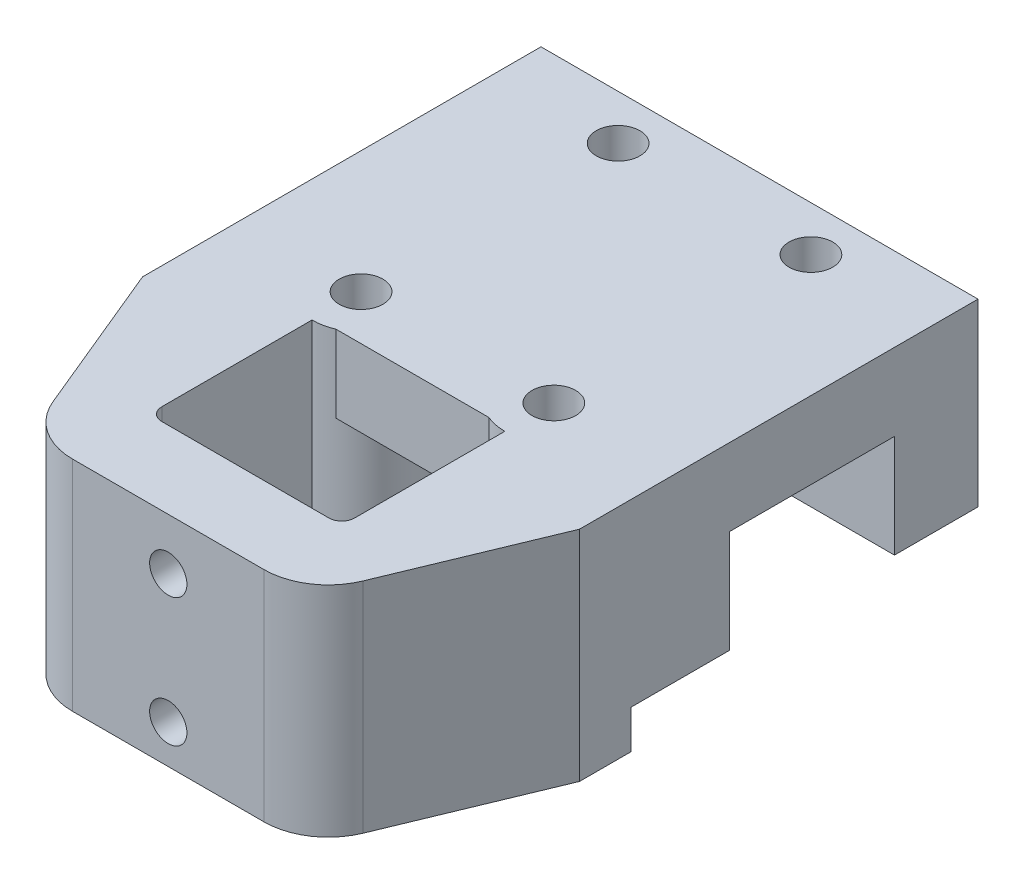
ISO-10303-21;
HEADER;
FILE_DESCRIPTION(('STEP AP214'),'2;1');
FILE_NAME('part.step','',(''),(''),'','','');
FILE_SCHEMA(('AUTOMOTIVE_DESIGN { 1 0 10303 214 1 1 1 1 }'));
ENDSEC;
DATA;
#1=APPLICATION_CONTEXT('core data for automotive mechanical design processes');
#2=APPLICATION_PROTOCOL_DEFINITION('international standard','automotive_design',2000,#1);
#3=PRODUCT_CONTEXT('',#1,'mechanical');
#4=PRODUCT('Part','Part','',(#3));
#5=PRODUCT_RELATED_PRODUCT_CATEGORY('part','',(#4));
#6=PRODUCT_DEFINITION_FORMATION('','',#4);
#7=PRODUCT_DEFINITION_CONTEXT('part definition',#1,'design');
#8=PRODUCT_DEFINITION('design','',#6,#7);
#9=PRODUCT_DEFINITION_SHAPE('','',#8);
#10=(LENGTH_UNIT() NAMED_UNIT(*) SI_UNIT(.MILLI.,.METRE.));
#11=(NAMED_UNIT(*) PLANE_ANGLE_UNIT() SI_UNIT($,.RADIAN.));
#12=(NAMED_UNIT(*) SI_UNIT($,.STERADIAN.) SOLID_ANGLE_UNIT());
#13=UNCERTAINTY_MEASURE_WITH_UNIT(LENGTH_MEASURE(1.E-05),#10,'distance_accuracy_value','');
#14=(GEOMETRIC_REPRESENTATION_CONTEXT(3) GLOBAL_UNCERTAINTY_ASSIGNED_CONTEXT((#13)) GLOBAL_UNIT_ASSIGNED_CONTEXT((#10,
#11,#12)) REPRESENTATION_CONTEXT('',''));
#15=CARTESIAN_POINT('',(0.,0.,0.));
#16=DIRECTION('',(0.,0.,1.));
#17=DIRECTION('',(1.,0.,0.));
#18=AXIS2_PLACEMENT_3D('',#15,#16,#17);
#19=CARTESIAN_POINT('',(17.,-14.,32.5));
#20=DIRECTION('',(0.,-1.,0.));
#21=DIRECTION('',(0.,0.,-1.));
#22=AXIS2_PLACEMENT_3D('',#19,#20,#21);
#23=PLANE('',#22);
#24=CARTESIAN_POINT('',(-7.49999999999998,-14.,10.));
#25=DIRECTION('',(0.,1.,0.));
#26=DIRECTION('',(0.,0.,1.));
#27=AXIS2_PLACEMENT_3D('',#24,#25,#26);
#28=CIRCLE('',#27,1.7);
#29=CARTESIAN_POINT('',(-7.49999999999998,-14.,11.7));
#30=VERTEX_POINT('',#29);
#31=EDGE_CURVE('E349',#30,#30,#28,.T.);
#32=ORIENTED_EDGE('',*,*,#31,.T.);
#33=EDGE_LOOP('',(#32));
#34=FACE_BOUND('',#33,.T.);
#35=DIRECTION('',(0.,0.,1.));
#36=VECTOR('',#35,1.);
#37=CARTESIAN_POINT('',(-7.49999999999997,-14.,13.5));
#38=LINE('',#37,#36);
#39=CARTESIAN_POINT('',(-7.49999999999997,-14.,13.5));
#40=VERTEX_POINT('',#39);
#41=CARTESIAN_POINT('',(-7.49999999999997,-14.,13.8165999999998));
#42=VERTEX_POINT('',#41);
#43=EDGE_CURVE('E251',#40,#42,#38,.T.);
#44=ORIENTED_EDGE('',*,*,#43,.F.);
#45=DIRECTION('',(1.,0.,0.));
#46=VECTOR('',#45,1.);
#47=CARTESIAN_POINT('',(-17.,-14.,13.5));
#48=LINE('',#47,#46);
#49=CARTESIAN_POINT('',(-17.,-14.,13.5));
#50=VERTEX_POINT('',#49);
#51=EDGE_CURVE('E248',#50,#40,#48,.T.);
#52=ORIENTED_EDGE('',*,*,#51,.F.);
#53=DIRECTION('',(0.,0.,1.));
#54=VECTOR('',#53,1.);
#55=CARTESIAN_POINT('',(-17.,-14.,-13.5));
#56=LINE('',#55,#54);
#57=CARTESIAN_POINT('',(-17.,-14.,5.81659999999999));
#58=VERTEX_POINT('',#57);
#59=EDGE_CURVE('E377',#58,#50,#56,.T.);
#60=ORIENTED_EDGE('',*,*,#59,.F.);
#61=DIRECTION('',(1.,0.,0.));
#62=VECTOR('',#61,1.);
#63=CARTESIAN_POINT('',(-17.,-14.,5.81659999999999));
#64=LINE('',#63,#62);
#65=CARTESIAN_POINT('',(-7.49999999999999,-14.,5.81659999999999));
#66=VERTEX_POINT('',#65);
#67=EDGE_CURVE('E344',#58,#66,#64,.T.);
#68=ORIENTED_EDGE('',*,*,#67,.T.);
#69=CARTESIAN_POINT('',(-7.49999999999998,-14.,9.81659999999987));
#70=DIRECTION('',(0.,-1.,0.));
#71=DIRECTION('',(0.,0.,1.));
#72=AXIS2_PLACEMENT_3D('',#69,#70,#71);
#73=CIRCLE('',#72,3.99999999999994);
#74=EDGE_CURVE('E298',#66,#42,#73,.T.);
#75=ORIENTED_EDGE('',*,*,#74,.T.);
#76=EDGE_LOOP('',(#44,#52,#60,#68,#75));
#77=FACE_BOUND('',#76,.T.);
#78=ADVANCED_FACE('F32',(#34,#77),#23,.T.);
#79=CARTESIAN_POINT('',(7.49999999999998,-14.,10.));
#80=DIRECTION('',(0.,1.,0.));
#81=DIRECTION('',(0.,0.,1.));
#82=AXIS2_PLACEMENT_3D('',#79,#80,#81);
#83=CIRCLE('',#82,1.7);
#84=CARTESIAN_POINT('',(7.49999999999998,-14.,11.7));
#85=VERTEX_POINT('',#84);
#86=EDGE_CURVE('E367',#85,#85,#83,.T.);
#87=ORIENTED_EDGE('',*,*,#86,.T.);
#88=EDGE_LOOP('',(#87));
#89=FACE_BOUND('',#88,.T.);
#90=DIRECTION('',(1.,0.,0.));
#91=VECTOR('',#90,1.);
#92=CARTESIAN_POINT('',(7.49999999999997,-14.,13.5));
#93=LINE('',#92,#91);
#94=CARTESIAN_POINT('',(7.49999999999997,-14.,13.5));
#95=VERTEX_POINT('',#94);
#96=CARTESIAN_POINT('',(17.,-14.,13.5));
#97=VERTEX_POINT('',#96);
#98=EDGE_CURVE('E258',#95,#97,#93,.T.);
#99=ORIENTED_EDGE('',*,*,#98,.F.);
#100=DIRECTION('',(0.,0.,-1.));
#101=VECTOR('',#100,1.);
#102=CARTESIAN_POINT('',(7.49999999999997,-14.,26.5));
#103=LINE('',#102,#101);
#104=CARTESIAN_POINT('',(7.49999999999997,-14.,13.8165999999999));
#105=VERTEX_POINT('',#104);
#106=EDGE_CURVE('E255',#105,#95,#103,.T.);
#107=ORIENTED_EDGE('',*,*,#106,.F.);
#108=CARTESIAN_POINT('',(7.49999999999998,-14.,9.81659999999987));
#109=DIRECTION('',(0.,-1.,0.));
#110=DIRECTION('',(0.,0.,1.));
#111=AXIS2_PLACEMENT_3D('',#108,#109,#110);
#112=CIRCLE('',#111,3.99999999999994);
#113=CARTESIAN_POINT('',(7.49999999999998,-14.,5.81659999999993));
#114=VERTEX_POINT('',#113);
#115=EDGE_CURVE('E295',#105,#114,#112,.T.);
#116=ORIENTED_EDGE('',*,*,#115,.T.);
#117=CARTESIAN_POINT('',(17.,-14.,5.81659999999999));
#118=VERTEX_POINT('',#117);
#119=EDGE_CURVE('E334',#114,#118,#64,.T.);
#120=ORIENTED_EDGE('',*,*,#119,.T.);
#121=DIRECTION('',(0.,0.,-1.));
#122=VECTOR('',#121,1.);
#123=CARTESIAN_POINT('',(17.,-14.,-13.5));
#124=LINE('',#123,#122);
#125=EDGE_CURVE('E371',#97,#118,#124,.T.);
#126=ORIENTED_EDGE('',*,*,#125,.F.);
#127=EDGE_LOOP('',(#99,#107,#116,#120,#126));
#128=FACE_BOUND('',#127,.T.);
#129=ADVANCED_FACE('F455',(#89,#128),#23,.T.);
#130=CARTESIAN_POINT('',(-17.,-14.,5.81659999999999));
#131=DIRECTION('',(0.,0.,1.));
#132=DIRECTION('',(1.,0.,0.));
#133=AXIS2_PLACEMENT_3D('',#130,#131,#132);
#134=PLANE('',#133);
#135=DIRECTION('',(0.,1.,0.));
#136=VECTOR('',#135,1.);
#137=CARTESIAN_POINT('',(7.49999999999998,-14.,5.81659999999993));
#138=LINE('',#137,#136);
#139=CARTESIAN_POINT('',(7.49999999999998,-6.,5.81659999999993));
#140=VERTEX_POINT('',#139);
#141=EDGE_CURVE('E312',#114,#140,#138,.T.);
#142=ORIENTED_EDGE('',*,*,#141,.T.);
#143=DIRECTION('',(1.,0.,0.));
#144=VECTOR('',#143,1.);
#145=CARTESIAN_POINT('',(-17.,-6.,5.81659999999999));
#146=LINE('',#145,#144);
#147=CARTESIAN_POINT('',(17.,-6.,5.81659999999999));
#148=VERTEX_POINT('',#147);
#149=EDGE_CURVE('E339',#140,#148,#146,.T.);
#150=ORIENTED_EDGE('',*,*,#149,.T.);
#151=DIRECTION('',(0.,-1.,0.));
#152=VECTOR('',#151,1.);
#153=CARTESIAN_POINT('',(17.,-14.,5.81659999999999));
#154=LINE('',#153,#152);
#155=EDGE_CURVE('E308',#148,#118,#154,.T.);
#156=ORIENTED_EDGE('',*,*,#155,.T.);
#157=ORIENTED_EDGE('',*,*,#119,.F.);
#158=EDGE_LOOP('',(#142,#150,#156,#157));
#159=FACE_BOUND('',#158,.T.);
#160=ADVANCED_FACE('F458',(#159),#134,.F.);
#161=CARTESIAN_POINT('',(17.,-14.,-13.5));
#162=DIRECTION('',(1.,0.,0.));
#163=DIRECTION('',(0.,0.,-1.));
#164=AXIS2_PLACEMENT_3D('',#161,#162,#163);
#165=PLANE('',#164);
#166=DIRECTION('',(0.,0.,-1.));
#167=VECTOR('',#166,1.);
#168=CARTESIAN_POINT('',(17.,0.,-13.5));
#169=LINE('',#168,#167);
#170=CARTESIAN_POINT('',(17.,0.,17.4999999999999));
#171=VERTEX_POINT('',#170);
#172=CARTESIAN_POINT('',(17.,0.,-13.5));
#173=VERTEX_POINT('',#172);
#174=EDGE_CURVE('E370',#171,#173,#169,.T.);
#175=ORIENTED_EDGE('',*,*,#174,.F.);
#176=DIRECTION('',(0.,-1.,0.));
#177=VECTOR('',#176,1.);
#178=CARTESIAN_POINT('',(17.,-14.,17.4999999999999));
#179=LINE('',#178,#177);
#180=CARTESIAN_POINT('',(17.,-17.,17.4999999999999));
#181=VERTEX_POINT('',#180);
#182=EDGE_CURVE('E396',#171,#181,#179,.T.);
#183=ORIENTED_EDGE('',*,*,#182,.T.);
#184=DIRECTION('',(0.,0.,1.));
#185=VECTOR('',#184,1.);
#186=CARTESIAN_POINT('',(17.,-17.,13.5000000000001));
#187=LINE('',#186,#185);
#188=CARTESIAN_POINT('',(17.,-17.,13.5000000000001));
#189=VERTEX_POINT('',#188);
#190=EDGE_CURVE('E244',#189,#181,#187,.T.);
#191=ORIENTED_EDGE('',*,*,#190,.F.);
#192=DIRECTION('',(0.,1.,0.));
#193=VECTOR('',#192,1.);
#194=CARTESIAN_POINT('',(17.,-17.,13.5000000000001));
#195=LINE('',#194,#193);
#196=EDGE_CURVE('E247',#189,#97,#195,.T.);
#197=ORIENTED_EDGE('',*,*,#196,.T.);
#198=ORIENTED_EDGE('',*,*,#125,.T.);
#199=ORIENTED_EDGE('',*,*,#155,.F.);
#200=DIRECTION('',(0.,0.,1.));
#201=VECTOR('',#200,1.);
#202=CARTESIAN_POINT('',(17.,-6.,5.81659999999999));
#203=LINE('',#202,#201);
#204=CARTESIAN_POINT('',(17.,-6.,-7.));
#205=VERTEX_POINT('',#204);
#206=EDGE_CURVE('E322',#205,#148,#203,.T.);
#207=ORIENTED_EDGE('',*,*,#206,.F.);
#208=DIRECTION('',(0.,1.,0.));
#209=VECTOR('',#208,1.);
#210=CARTESIAN_POINT('',(17.,-14.,-7.));
#211=LINE('',#210,#209);
#212=CARTESIAN_POINT('',(17.,-14.,-7.));
#213=VERTEX_POINT('',#212);
#214=EDGE_CURVE('E319',#213,#205,#211,.T.);
#215=ORIENTED_EDGE('',*,*,#214,.F.);
#216=CARTESIAN_POINT('',(17.,-14.,-13.5));
#217=VERTEX_POINT('',#216);
#218=EDGE_CURVE('E374',#213,#217,#124,.T.);
#219=ORIENTED_EDGE('',*,*,#218,.T.);
#220=DIRECTION('',(0.,1.,0.));
#221=VECTOR('',#220,1.);
#222=CARTESIAN_POINT('',(17.,-14.,-13.5));
#223=LINE('',#222,#221);
#224=EDGE_CURVE('E381',#217,#173,#223,.T.);
#225=ORIENTED_EDGE('',*,*,#224,.T.);
#226=EDGE_LOOP('',(#175,#183,#191,#197,#198,#199,#207,#215,#219,#225));
#227=FACE_BOUND('',#226,.T.);
#228=ADVANCED_FACE('F443',(#227),#165,.T.);
#229=CARTESIAN_POINT('',(17.,-14.,32.5));
#230=DIRECTION('',(0.,0.,1.));
#231=DIRECTION('',(1.,0.,0.));
#232=AXIS2_PLACEMENT_3D('',#229,#230,#231);
#233=PLANE('',#232);
#234=CARTESIAN_POINT('',(0.,-4.,32.5));
#235=DIRECTION('',(0.,0.,1.));
#236=DIRECTION('',(1.,0.,0.));
#237=AXIS2_PLACEMENT_3D('',#234,#235,#236);
#238=CIRCLE('',#237,1.44999999999999);
#239=CARTESIAN_POINT('',(1.44999999999999,-4.,32.5));
#240=VERTEX_POINT('',#239);
#241=EDGE_CURVE('E846',#240,#240,#238,.T.);
#242=ORIENTED_EDGE('',*,*,#241,.F.);
#243=EDGE_LOOP('',(#242));
#244=FACE_BOUND('',#243,.T.);
#245=CARTESIAN_POINT('',(0.,-14.,32.5));
#246=DIRECTION('',(0.,0.,1.));
#247=DIRECTION('',(1.,0.,0.));
#248=AXIS2_PLACEMENT_3D('',#245,#246,#247);
#249=CIRCLE('',#248,1.44999999999999);
#250=CARTESIAN_POINT('',(1.44999999999999,-14.,32.5));
#251=VERTEX_POINT('',#250);
#252=EDGE_CURVE('E839',#251,#251,#249,.T.);
#253=ORIENTED_EDGE('',*,*,#252,.F.);
#254=EDGE_LOOP('',(#253));
#255=FACE_BOUND('',#254,.T.);
#256=DIRECTION('',(-1.,0.,0.));
#257=VECTOR('',#256,1.);
#258=CARTESIAN_POINT('',(10.7867965644036,-17.,32.5));
#259=LINE('',#258,#257);
#260=CARTESIAN_POINT('',(7.44590337480707,-17.,32.5));
#261=VERTEX_POINT('',#260);
#262=CARTESIAN_POINT('',(-7.44590337480706,-17.,32.5));
#263=VERTEX_POINT('',#262);
#264=EDGE_CURVE('E211',#261,#263,#259,.T.);
#265=ORIENTED_EDGE('',*,*,#264,.F.);
#266=DIRECTION('',(0.,-1.,0.));
#267=VECTOR('',#266,1.);
#268=CARTESIAN_POINT('',(7.44590337480707,-14.,32.5));
#269=LINE('',#268,#267);
#270=CARTESIAN_POINT('',(7.44590337480707,0.,32.5));
#271=VERTEX_POINT('',#270);
#272=EDGE_CURVE('E419',#261,#271,#269,.F.);
#273=ORIENTED_EDGE('',*,*,#272,.T.);
#274=DIRECTION('',(1.,0.,0.));
#275=VECTOR('',#274,1.);
#276=CARTESIAN_POINT('',(17.,0.,32.5));
#277=LINE('',#276,#275);
#278=CARTESIAN_POINT('',(-7.44590337480706,0.,32.5));
#279=VERTEX_POINT('',#278);
#280=EDGE_CURVE('E388',#279,#271,#277,.T.);
#281=ORIENTED_EDGE('',*,*,#280,.F.);
#282=DIRECTION('',(0.,1.,0.));
#283=VECTOR('',#282,1.);
#284=CARTESIAN_POINT('',(-7.44590337480706,-14.,32.5));
#285=LINE('',#284,#283);
#286=EDGE_CURVE('E416',#279,#263,#285,.F.);
#287=ORIENTED_EDGE('',*,*,#286,.T.);
#288=EDGE_LOOP('',(#265,#273,#281,#287));
#289=FACE_BOUND('',#288,.T.);
#290=ADVANCED_FACE('F432',(#244,#255,#289),#233,.T.);
#291=CARTESIAN_POINT('',(-17.,-14.,-13.5));
#292=DIRECTION('',(-1.,0.,0.));
#293=DIRECTION('',(0.,0.,1.));
#294=AXIS2_PLACEMENT_3D('',#291,#292,#293);
#295=PLANE('',#294);
#296=ORIENTED_EDGE('',*,*,#59,.T.);
#297=DIRECTION('',(0.,1.,0.));
#298=VECTOR('',#297,1.);
#299=CARTESIAN_POINT('',(-17.,-17.,13.5));
#300=LINE('',#299,#298);
#301=CARTESIAN_POINT('',(-17.,-17.,13.5));
#302=VERTEX_POINT('',#301);
#303=EDGE_CURVE('E227',#302,#50,#300,.T.);
#304=ORIENTED_EDGE('',*,*,#303,.F.);
#305=DIRECTION('',(0.,0.,-1.));
#306=VECTOR('',#305,1.);
#307=CARTESIAN_POINT('',(-17.,-17.,17.4999999999998));
#308=LINE('',#307,#306);
#309=CARTESIAN_POINT('',(-17.,-17.,17.4999999999998));
#310=VERTEX_POINT('',#309);
#311=EDGE_CURVE('E207',#310,#302,#308,.T.);
#312=ORIENTED_EDGE('',*,*,#311,.F.);
#313=DIRECTION('',(0.,1.,0.));
#314=VECTOR('',#313,1.);
#315=CARTESIAN_POINT('',(-17.,-14.,17.4999999999999));
#316=LINE('',#315,#314);
#317=CARTESIAN_POINT('',(-17.,0.,17.4999999999998));
#318=VERTEX_POINT('',#317);
#319=EDGE_CURVE('E214',#310,#318,#316,.T.);
#320=ORIENTED_EDGE('',*,*,#319,.T.);
#321=DIRECTION('',(0.,0.,1.));
#322=VECTOR('',#321,1.);
#323=CARTESIAN_POINT('',(-17.,0.,-13.5));
#324=LINE('',#323,#322);
#325=CARTESIAN_POINT('',(-17.,0.,-13.5));
#326=VERTEX_POINT('',#325);
#327=EDGE_CURVE('E386',#326,#318,#324,.T.);
#328=ORIENTED_EDGE('',*,*,#327,.F.);
#329=DIRECTION('',(0.,1.,0.));
#330=VECTOR('',#329,1.);
#331=CARTESIAN_POINT('',(-17.,-14.,-13.5));
#332=LINE('',#331,#330);
#333=CARTESIAN_POINT('',(-17.,-14.,-13.5));
#334=VERTEX_POINT('',#333);
#335=EDGE_CURVE('E222',#334,#326,#332,.T.);
#336=ORIENTED_EDGE('',*,*,#335,.F.);
#337=CARTESIAN_POINT('',(-17.,-14.,-7.));
#338=VERTEX_POINT('',#337);
#339=EDGE_CURVE('E378',#334,#338,#56,.T.);
#340=ORIENTED_EDGE('',*,*,#339,.T.);
#341=DIRECTION('',(0.,1.,0.));
#342=VECTOR('',#341,1.);
#343=CARTESIAN_POINT('',(-17.,-14.,-7.));
#344=LINE('',#343,#342);
#345=CARTESIAN_POINT('',(-17.,-6.,-7.));
#346=VERTEX_POINT('',#345);
#347=EDGE_CURVE('E328',#338,#346,#344,.T.);
#348=ORIENTED_EDGE('',*,*,#347,.T.);
#349=DIRECTION('',(0.,0.,1.));
#350=VECTOR('',#349,1.);
#351=CARTESIAN_POINT('',(-17.,-6.,5.81659999999999));
#352=LINE('',#351,#350);
#353=CARTESIAN_POINT('',(-17.,-6.,5.81659999999999));
#354=VERTEX_POINT('',#353);
#355=EDGE_CURVE('E331',#346,#354,#352,.T.);
#356=ORIENTED_EDGE('',*,*,#355,.T.);
#357=DIRECTION('',(0.,-1.,0.));
#358=VECTOR('',#357,1.);
#359=CARTESIAN_POINT('',(-17.,-14.,5.81659999999999));
#360=LINE('',#359,#358);
#361=EDGE_CURVE('E325',#354,#58,#360,.T.);
#362=ORIENTED_EDGE('',*,*,#361,.T.);
#363=EDGE_LOOP('',(#296,#304,#312,#320,#328,#336,#340,#348,#356,#362));
#364=FACE_BOUND('',#363,.T.);
#365=ADVANCED_FACE('F225',(#364),#295,.T.);
#366=CARTESIAN_POINT('',(17.,-14.,-13.5));
#367=DIRECTION('',(0.,0.,-1.));
#368=DIRECTION('',(-1.,0.,0.));
#369=AXIS2_PLACEMENT_3D('',#366,#367,#368);
#370=PLANE('',#369);
#371=DIRECTION('',(-1.,0.,0.));
#372=VECTOR('',#371,1.);
#373=CARTESIAN_POINT('',(17.,0.,-13.5));
#374=LINE('',#373,#372);
#375=EDGE_CURVE('E383',#173,#326,#374,.T.);
#376=ORIENTED_EDGE('',*,*,#375,.F.);
#377=ORIENTED_EDGE('',*,*,#224,.F.);
#378=DIRECTION('',(-1.,0.,0.));
#379=VECTOR('',#378,1.);
#380=CARTESIAN_POINT('',(17.,-14.,-13.5));
#381=LINE('',#380,#379);
#382=EDGE_CURVE('E373',#217,#334,#381,.T.);
#383=ORIENTED_EDGE('',*,*,#382,.T.);
#384=ORIENTED_EDGE('',*,*,#335,.T.);
#385=EDGE_LOOP('',(#376,#377,#383,#384));
#386=FACE_BOUND('',#385,.T.);
#387=ADVANCED_FACE('F476',(#386),#370,.T.);
#388=DIRECTION('',(1.,0.,0.));
#389=VECTOR('',#388,1.);
#390=CARTESIAN_POINT('',(-17.,-14.,-7.));
#391=LINE('',#390,#389);
#392=EDGE_CURVE('E342',#338,#213,#391,.T.);
#393=ORIENTED_EDGE('',*,*,#392,.F.);
#394=ORIENTED_EDGE('',*,*,#339,.F.);
#395=ORIENTED_EDGE('',*,*,#382,.F.);
#396=ORIENTED_EDGE('',*,*,#218,.F.);
#397=EDGE_LOOP('',(#393,#394,#395,#396));
#398=FACE_BOUND('',#397,.T.);
#399=CARTESIAN_POINT('',(-7.49999999999998,-14.,-10.));
#400=DIRECTION('',(0.,1.,0.));
#401=DIRECTION('',(0.,0.,1.));
#402=AXIS2_PLACEMENT_3D('',#399,#400,#401);
#403=CIRCLE('',#402,1.7);
#404=CARTESIAN_POINT('',(-7.49999999999998,-14.,-8.3));
#405=VERTEX_POINT('',#404);
#406=EDGE_CURVE('E355',#405,#405,#403,.T.);
#407=ORIENTED_EDGE('',*,*,#406,.T.);
#408=EDGE_LOOP('',(#407));
#409=FACE_BOUND('',#408,.T.);
#410=CARTESIAN_POINT('',(7.49999999999998,-14.,-10.));
#411=DIRECTION('',(0.,1.,0.));
#412=DIRECTION('',(0.,0.,1.));
#413=AXIS2_PLACEMENT_3D('',#410,#411,#412);
#414=CIRCLE('',#413,1.7);
#415=CARTESIAN_POINT('',(7.49999999999998,-14.,-8.30000000000001));
#416=VERTEX_POINT('',#415);
#417=EDGE_CURVE('E361',#416,#416,#414,.T.);
#418=ORIENTED_EDGE('',*,*,#417,.T.);
#419=EDGE_LOOP('',(#418));
#420=FACE_BOUND('',#419,.T.);
#421=ADVANCED_FACE('F471',(#398,#409,#420),#23,.T.);
#422=CARTESIAN_POINT('',(17.,0.,32.5));
#423=DIRECTION('',(0.,-1.,0.));
#424=DIRECTION('',(0.,0.,-1.));
#425=AXIS2_PLACEMENT_3D('',#422,#423,#424);
#426=PLANE('',#425);
#427=DIRECTION('',(0.,0.,1.));
#428=VECTOR('',#427,1.);
#429=CARTESIAN_POINT('',(-7.49999999999997,0.,26.5));
#430=LINE('',#429,#428);
#431=CARTESIAN_POINT('',(-7.49999999999997,0.,13.8165999999998));
#432=VERTEX_POINT('',#431);
#433=CARTESIAN_POINT('',(-7.49999999999997,0.,25.5));
#434=VERTEX_POINT('',#433);
#435=EDGE_CURVE('E278',#432,#434,#430,.T.);
#436=ORIENTED_EDGE('',*,*,#435,.F.);
#437=CARTESIAN_POINT('',(-7.49999999999998,0.,9.81659999999987));
#438=DIRECTION('',(0.,-1.,0.));
#439=DIRECTION('',(0.,0.,-1.));
#440=AXIS2_PLACEMENT_3D('',#437,#438,#439);
#441=CIRCLE('',#440,3.99999999999993);
#442=CARTESIAN_POINT('',(-5.94033194557347,0.,13.5));
#443=VERTEX_POINT('',#442);
#444=EDGE_CURVE('E281',#443,#432,#441,.T.);
#445=ORIENTED_EDGE('',*,*,#444,.F.);
#446=DIRECTION('',(-1.,0.,0.));
#447=VECTOR('',#446,1.);
#448=CARTESIAN_POINT('',(5.94033194557354,0.,13.5));
#449=LINE('',#448,#447);
#450=CARTESIAN_POINT('',(5.94033194557352,0.,13.5));
#451=VERTEX_POINT('',#450);
#452=EDGE_CURVE('E290',#451,#443,#449,.T.);
#453=ORIENTED_EDGE('',*,*,#452,.F.);
#454=CARTESIAN_POINT('',(7.49999999999998,0.,9.81659999999987));
#455=DIRECTION('',(0.,-1.,0.));
#456=DIRECTION('',(0.,0.,-1.));
#457=AXIS2_PLACEMENT_3D('',#454,#455,#456);
#458=CIRCLE('',#457,3.99999999999996);
#459=CARTESIAN_POINT('',(7.49999999999997,0.,13.8165999999999));
#460=VERTEX_POINT('',#459);
#461=EDGE_CURVE('E271',#460,#451,#458,.T.);
#462=ORIENTED_EDGE('',*,*,#461,.F.);
#463=DIRECTION('',(0.,0.,-1.));
#464=VECTOR('',#463,1.);
#465=CARTESIAN_POINT('',(7.49999999999997,0.,13.8165999999999));
#466=LINE('',#465,#464);
#467=CARTESIAN_POINT('',(7.49999999999997,0.,25.5));
#468=VERTEX_POINT('',#467);
#469=EDGE_CURVE('E273',#468,#460,#466,.T.);
#470=ORIENTED_EDGE('',*,*,#469,.F.);
#471=CARTESIAN_POINT('',(6.49999999999997,0.,25.5));
#472=DIRECTION('',(0.,-1.,0.));
#473=DIRECTION('',(0.,0.,-1.));
#474=AXIS2_PLACEMENT_3D('',#471,#472,#473);
#475=CIRCLE('',#474,1.);
#476=CARTESIAN_POINT('',(6.49999999999997,0.,26.5));
#477=VERTEX_POINT('',#476);
#478=EDGE_CURVE('E408',#468,#477,#475,.T.);
#479=ORIENTED_EDGE('',*,*,#478,.T.);
#480=DIRECTION('',(1.,0.,0.));
#481=VECTOR('',#480,1.);
#482=CARTESIAN_POINT('',(7.49999999999997,0.,26.5));
#483=LINE('',#482,#481);
#484=CARTESIAN_POINT('',(-6.49999999999997,0.,26.5));
#485=VERTEX_POINT('',#484);
#486=EDGE_CURVE('E275',#485,#477,#483,.T.);
#487=ORIENTED_EDGE('',*,*,#486,.F.);
#488=CARTESIAN_POINT('',(-6.49999999999997,0.,25.5));
#489=DIRECTION('',(0.,-1.,0.));
#490=DIRECTION('',(0.,0.,-1.));
#491=AXIS2_PLACEMENT_3D('',#488,#489,#490);
#492=CIRCLE('',#491,1.);
#493=EDGE_CURVE('E412',#485,#434,#492,.T.);
#494=ORIENTED_EDGE('',*,*,#493,.T.);
#495=EDGE_LOOP('',(#436,#445,#453,#462,#470,#479,#487,#494));
#496=FACE_BOUND('',#495,.T.);
#497=CARTESIAN_POINT('',(-7.49999999999998,0.,10.));
#498=DIRECTION('',(0.,1.,0.));
#499=DIRECTION('',(0.,0.,1.));
#500=AXIS2_PLACEMENT_3D('',#497,#498,#499);
#501=CIRCLE('',#500,1.69999999999999);
#502=CARTESIAN_POINT('',(-7.49999999999998,0.,11.7));
#503=VERTEX_POINT('',#502);
#504=EDGE_CURVE('E338',#503,#503,#501,.T.);
#505=ORIENTED_EDGE('',*,*,#504,.F.);
#506=EDGE_LOOP('',(#505));
#507=FACE_BOUND('',#506,.T.);
#508=CARTESIAN_POINT('',(-7.49999999999998,0.,-10.));
#509=DIRECTION('',(0.,1.,0.));
#510=DIRECTION('',(0.,0.,1.));
#511=AXIS2_PLACEMENT_3D('',#508,#509,#510);
#512=CIRCLE('',#511,1.69999999999999);
#513=CARTESIAN_POINT('',(-7.49999999999998,0.,-8.30000000000001));
#514=VERTEX_POINT('',#513);
#515=EDGE_CURVE('E352',#514,#514,#512,.T.);
#516=ORIENTED_EDGE('',*,*,#515,.F.);
#517=EDGE_LOOP('',(#516));
#518=FACE_BOUND('',#517,.T.);
#519=CARTESIAN_POINT('',(7.49999999999998,0.,-10.));
#520=DIRECTION('',(0.,1.,0.));
#521=DIRECTION('',(0.,0.,1.));
#522=AXIS2_PLACEMENT_3D('',#519,#520,#521);
#523=CIRCLE('',#522,1.69999999999999);
#524=CARTESIAN_POINT('',(7.49999999999998,0.,-8.30000000000001));
#525=VERTEX_POINT('',#524);
#526=EDGE_CURVE('E358',#525,#525,#523,.T.);
#527=ORIENTED_EDGE('',*,*,#526,.F.);
#528=EDGE_LOOP('',(#527));
#529=FACE_BOUND('',#528,.T.);
#530=CARTESIAN_POINT('',(7.49999999999998,0.,10.));
#531=DIRECTION('',(0.,1.,0.));
#532=DIRECTION('',(0.,0.,1.));
#533=AXIS2_PLACEMENT_3D('',#530,#531,#532);
#534=CIRCLE('',#533,1.69999999999999);
#535=CARTESIAN_POINT('',(7.49999999999998,0.,11.7));
#536=VERTEX_POINT('',#535);
#537=EDGE_CURVE('E364',#536,#536,#534,.T.);
#538=ORIENTED_EDGE('',*,*,#537,.F.);
#539=EDGE_LOOP('',(#538));
#540=FACE_BOUND('',#539,.T.);
#541=ORIENTED_EDGE('',*,*,#280,.T.);
#542=CARTESIAN_POINT('',(7.44590337480707,0.,27.5));
#543=DIRECTION('',(0.,-1.,0.));
#544=DIRECTION('',(0.,0.,-1.));
#545=AXIS2_PLACEMENT_3D('',#542,#543,#544);
#546=CIRCLE('',#545,5.);
#547=CARTESIAN_POINT('',(12.0653010373635,0.,29.4134171618254));
#548=VERTEX_POINT('',#547);
#549=EDGE_CURVE('E424',#271,#548,#546,.F.);
#550=ORIENTED_EDGE('',*,*,#549,.T.);
#551=DIRECTION('',(-0.382683432365087,0.,0.923879532511288));
#552=VECTOR('',#551,1.);
#553=CARTESIAN_POINT('',(10.7867965644036,0.,32.5));
#554=LINE('',#553,#552);
#555=EDGE_CURVE('E221',#548,#171,#554,.F.);
#556=ORIENTED_EDGE('',*,*,#555,.T.);
#557=ORIENTED_EDGE('',*,*,#174,.T.);
#558=ORIENTED_EDGE('',*,*,#375,.T.);
#559=ORIENTED_EDGE('',*,*,#327,.T.);
#560=DIRECTION('',(-0.382683432365087,0.,-0.923879532511288));
#561=VECTOR('',#560,1.);
#562=CARTESIAN_POINT('',(-17.,0.,17.4999999999999));
#563=LINE('',#562,#561);
#564=CARTESIAN_POINT('',(-12.0653010373635,0.,29.4134171618254));
#565=VERTEX_POINT('',#564);
#566=EDGE_CURVE('E217',#318,#565,#563,.F.);
#567=ORIENTED_EDGE('',*,*,#566,.T.);
#568=CARTESIAN_POINT('',(-7.44590337480706,0.,27.5));
#569=DIRECTION('',(0.,-1.,0.));
#570=DIRECTION('',(0.,0.,-1.));
#571=AXIS2_PLACEMENT_3D('',#568,#569,#570);
#572=CIRCLE('',#571,5.);
#573=EDGE_CURVE('E422',#565,#279,#572,.F.);
#574=ORIENTED_EDGE('',*,*,#573,.T.);
#575=EDGE_LOOP('',(#541,#550,#556,#557,#558,#559,#567,#574));
#576=FACE_BOUND('',#575,.T.);
#577=ADVANCED_FACE('F437',(#496,#507,#518,#529,#540,#576),#426,.F.);
#578=CARTESIAN_POINT('',(7.49999999999998,0.,10.));
#579=DIRECTION('',(0.,1.,0.));
#580=DIRECTION('',(0.,0.,1.));
#581=AXIS2_PLACEMENT_3D('',#578,#579,#580);
#582=CYLINDRICAL_SURFACE('',#581,1.69999999999999);
#583=ORIENTED_EDGE('',*,*,#86,.F.);
#584=EDGE_LOOP('',(#583));
#585=FACE_BOUND('',#584,.T.);
#586=ORIENTED_EDGE('',*,*,#537,.T.);
#587=EDGE_LOOP('',(#586));
#588=FACE_BOUND('',#587,.T.);
#589=ADVANCED_FACE('F546',(#585,#588),#582,.F.);
#590=CARTESIAN_POINT('',(7.49999999999998,0.,-10.));
#591=DIRECTION('',(0.,1.,0.));
#592=DIRECTION('',(0.,0.,1.));
#593=AXIS2_PLACEMENT_3D('',#590,#591,#592);
#594=CYLINDRICAL_SURFACE('',#593,1.69999999999999);
#595=ORIENTED_EDGE('',*,*,#417,.F.);
#596=EDGE_LOOP('',(#595));
#597=FACE_BOUND('',#596,.T.);
#598=ORIENTED_EDGE('',*,*,#526,.T.);
#599=EDGE_LOOP('',(#598));
#600=FACE_BOUND('',#599,.T.);
#601=ADVANCED_FACE('F767',(#597,#600),#594,.F.);
#602=CARTESIAN_POINT('',(-7.49999999999998,0.,-10.));
#603=DIRECTION('',(0.,1.,0.));
#604=DIRECTION('',(0.,0.,1.));
#605=AXIS2_PLACEMENT_3D('',#602,#603,#604);
#606=CYLINDRICAL_SURFACE('',#605,1.69999999999999);
#607=ORIENTED_EDGE('',*,*,#406,.F.);
#608=EDGE_LOOP('',(#607));
#609=FACE_BOUND('',#608,.T.);
#610=ORIENTED_EDGE('',*,*,#515,.T.);
#611=EDGE_LOOP('',(#610));
#612=FACE_BOUND('',#611,.T.);
#613=ADVANCED_FACE('F757',(#609,#612),#606,.F.);
#614=CARTESIAN_POINT('',(-7.49999999999998,0.,10.));
#615=DIRECTION('',(0.,1.,0.));
#616=DIRECTION('',(0.,0.,1.));
#617=AXIS2_PLACEMENT_3D('',#614,#615,#616);
#618=CYLINDRICAL_SURFACE('',#617,1.69999999999999);
#619=ORIENTED_EDGE('',*,*,#31,.F.);
#620=EDGE_LOOP('',(#619));
#621=FACE_BOUND('',#620,.T.);
#622=ORIENTED_EDGE('',*,*,#504,.T.);
#623=EDGE_LOOP('',(#622));
#624=FACE_BOUND('',#623,.T.);
#625=ADVANCED_FACE('F732',(#621,#624),#618,.F.);
#626=CARTESIAN_POINT('',(-7.49999999999999,-6.,5.81659999999999));
#627=VERTEX_POINT('',#626);
#628=EDGE_CURVE('E335',#354,#627,#146,.T.);
#629=ORIENTED_EDGE('',*,*,#628,.T.);
#630=DIRECTION('',(0.,1.,0.));
#631=VECTOR('',#630,1.);
#632=CARTESIAN_POINT('',(-7.49999999999999,-14.,5.81659999999999));
#633=LINE('',#632,#631);
#634=EDGE_CURVE('E309',#66,#627,#633,.T.);
#635=ORIENTED_EDGE('',*,*,#634,.F.);
#636=ORIENTED_EDGE('',*,*,#67,.F.);
#637=ORIENTED_EDGE('',*,*,#361,.F.);
#638=EDGE_LOOP('',(#629,#635,#636,#637));
#639=FACE_BOUND('',#638,.T.);
#640=ADVANCED_FACE('F483',(#639),#134,.F.);
#641=CARTESIAN_POINT('',(-17.,-6.,5.81659999999999));
#642=DIRECTION('',(0.,1.,0.));
#643=DIRECTION('',(0.,0.,1.));
#644=AXIS2_PLACEMENT_3D('',#641,#642,#643);
#645=PLANE('',#644);
#646=CARTESIAN_POINT('',(7.49999999999998,-6.,9.81659999999987));
#647=DIRECTION('',(0.,-1.,0.));
#648=DIRECTION('',(0.,0.,1.));
#649=AXIS2_PLACEMENT_3D('',#646,#647,#648);
#650=CIRCLE('',#649,3.99999999999994);
#651=CARTESIAN_POINT('',(5.94033194557352,-6.,13.5));
#652=VERTEX_POINT('',#651);
#653=EDGE_CURVE('E294',#652,#140,#650,.T.);
#654=ORIENTED_EDGE('',*,*,#653,.F.);
#655=DIRECTION('',(1.,0.,0.));
#656=VECTOR('',#655,1.);
#657=CARTESIAN_POINT('',(5.94033194557354,-6.,13.5));
#658=LINE('',#657,#656);
#659=CARTESIAN_POINT('',(-5.94033194557347,-6.,13.5));
#660=VERTEX_POINT('',#659);
#661=EDGE_CURVE('E284',#660,#652,#658,.T.);
#662=ORIENTED_EDGE('',*,*,#661,.F.);
#663=CARTESIAN_POINT('',(-7.49999999999998,-6.,9.81659999999987));
#664=DIRECTION('',(0.,-1.,0.));
#665=DIRECTION('',(0.,0.,1.));
#666=AXIS2_PLACEMENT_3D('',#663,#664,#665);
#667=CIRCLE('',#666,3.99999999999994);
#668=EDGE_CURVE('E299',#627,#660,#667,.T.);
#669=ORIENTED_EDGE('',*,*,#668,.F.);
#670=ORIENTED_EDGE('',*,*,#628,.F.);
#671=ORIENTED_EDGE('',*,*,#355,.F.);
#672=DIRECTION('',(1.,0.,0.));
#673=VECTOR('',#672,1.);
#674=CARTESIAN_POINT('',(-17.,-6.,-7.));
#675=LINE('',#674,#673);
#676=EDGE_CURVE('E340',#346,#205,#675,.T.);
#677=ORIENTED_EDGE('',*,*,#676,.T.);
#678=ORIENTED_EDGE('',*,*,#206,.T.);
#679=ORIENTED_EDGE('',*,*,#149,.F.);
#680=EDGE_LOOP('',(#654,#662,#669,#670,#671,#677,#678,#679));
#681=FACE_BOUND('',#680,.T.);
#682=ADVANCED_FACE('F462',(#681),#645,.F.);
#683=CARTESIAN_POINT('',(-17.,-14.,-7.));
#684=DIRECTION('',(0.,0.,-1.));
#685=DIRECTION('',(-1.,0.,0.));
#686=AXIS2_PLACEMENT_3D('',#683,#684,#685);
#687=PLANE('',#686);
#688=ORIENTED_EDGE('',*,*,#676,.F.);
#689=ORIENTED_EDGE('',*,*,#347,.F.);
#690=ORIENTED_EDGE('',*,*,#392,.T.);
#691=ORIENTED_EDGE('',*,*,#214,.T.);
#692=EDGE_LOOP('',(#688,#689,#690,#691));
#693=FACE_BOUND('',#692,.T.);
#694=ADVANCED_FACE('F478',(#693),#687,.F.);
#695=CARTESIAN_POINT('',(-7.49999999999997,-14.,13.8165999999999));
#696=DIRECTION('',(-1.,0.,0.));
#697=DIRECTION('',(0.,0.,1.));
#698=AXIS2_PLACEMENT_3D('',#695,#696,#697);
#699=PLANE('',#698);
#700=ORIENTED_EDGE('',*,*,#435,.T.);
#701=DIRECTION('',(0.,1.,0.));
#702=VECTOR('',#701,1.);
#703=CARTESIAN_POINT('',(-7.49999999999997,-17.,25.5));
#704=LINE('',#703,#702);
#705=CARTESIAN_POINT('',(-7.49999999999997,-17.,25.5));
#706=VERTEX_POINT('',#705);
#707=EDGE_CURVE('E406',#434,#706,#704,.F.);
#708=ORIENTED_EDGE('',*,*,#707,.T.);
#709=DIRECTION('',(0.,0.,1.));
#710=VECTOR('',#709,1.);
#711=CARTESIAN_POINT('',(-7.49999999999997,-17.,13.5));
#712=LINE('',#711,#710);
#713=CARTESIAN_POINT('',(-7.49999999999997,-17.,13.5));
#714=VERTEX_POINT('',#713);
#715=EDGE_CURVE('E231',#714,#706,#712,.T.);
#716=ORIENTED_EDGE('',*,*,#715,.F.);
#717=DIRECTION('',(0.,1.,0.));
#718=VECTOR('',#717,1.);
#719=CARTESIAN_POINT('',(-7.49999999999997,-17.,13.5));
#720=LINE('',#719,#718);
#721=EDGE_CURVE('E267',#714,#40,#720,.T.);
#722=ORIENTED_EDGE('',*,*,#721,.T.);
#723=ORIENTED_EDGE('',*,*,#43,.T.);
#724=DIRECTION('',(0.,1.,0.));
#725=VECTOR('',#724,1.);
#726=CARTESIAN_POINT('',(-7.49999999999997,-14.,13.8165999999998));
#727=LINE('',#726,#725);
#728=EDGE_CURVE('E306',#42,#432,#727,.T.);
#729=ORIENTED_EDGE('',*,*,#728,.T.);
#730=EDGE_LOOP('',(#700,#708,#716,#722,#723,#729));
#731=FACE_BOUND('',#730,.T.);
#732=ADVANCED_FACE('F491',(#731),#699,.F.);
#733=CARTESIAN_POINT('',(-7.49999999999998,-14.,9.81659999999987));
#734=DIRECTION('',(0.,1.,0.));
#735=DIRECTION('',(0.,0.,1.));
#736=AXIS2_PLACEMENT_3D('',#733,#734,#735);
#737=CYLINDRICAL_SURFACE('',#736,3.99999999999994);
#738=ORIENTED_EDGE('',*,*,#668,.T.);
#739=DIRECTION('',(0.,-1.,0.));
#740=VECTOR('',#739,1.);
#741=CARTESIAN_POINT('',(-5.94033194557347,0.001000000000001,13.5));
#742=LINE('',#741,#740);
#743=EDGE_CURVE('E287',#443,#660,#742,.T.);
#744=ORIENTED_EDGE('',*,*,#743,.F.);
#745=ORIENTED_EDGE('',*,*,#444,.T.);
#746=ORIENTED_EDGE('',*,*,#728,.F.);
#747=ORIENTED_EDGE('',*,*,#74,.F.);
#748=ORIENTED_EDGE('',*,*,#634,.T.);
#749=EDGE_LOOP('',(#738,#744,#745,#746,#747,#748));
#750=FACE_BOUND('',#749,.T.);
#751=ADVANCED_FACE('F519',(#750),#737,.T.);
#752=CARTESIAN_POINT('',(7.49999999999998,-14.,9.81659999999987));
#753=DIRECTION('',(0.,1.,0.));
#754=DIRECTION('',(0.,0.,1.));
#755=AXIS2_PLACEMENT_3D('',#752,#753,#754);
#756=CYLINDRICAL_SURFACE('',#755,3.99999999999994);
#757=DIRECTION('',(0.,1.,0.));
#758=VECTOR('',#757,1.);
#759=CARTESIAN_POINT('',(7.49999999999997,-14.,13.8165999999999));
#760=LINE('',#759,#758);
#761=EDGE_CURVE('E302',#105,#460,#760,.T.);
#762=ORIENTED_EDGE('',*,*,#761,.T.);
#763=ORIENTED_EDGE('',*,*,#461,.T.);
#764=DIRECTION('',(0.,-1.,0.));
#765=VECTOR('',#764,1.);
#766=CARTESIAN_POINT('',(5.94033194557352,0.001000000000001,13.5));
#767=LINE('',#766,#765);
#768=EDGE_CURVE('E288',#451,#652,#767,.T.);
#769=ORIENTED_EDGE('',*,*,#768,.T.);
#770=ORIENTED_EDGE('',*,*,#653,.T.);
#771=ORIENTED_EDGE('',*,*,#141,.F.);
#772=ORIENTED_EDGE('',*,*,#115,.F.);
#773=EDGE_LOOP('',(#762,#763,#769,#770,#771,#772));
#774=FACE_BOUND('',#773,.T.);
#775=ADVANCED_FACE('F515',(#774),#756,.T.);
#776=CARTESIAN_POINT('',(7.49999999999997,-14.,13.8165999999999));
#777=DIRECTION('',(1.,0.,0.));
#778=DIRECTION('',(0.,0.,-1.));
#779=AXIS2_PLACEMENT_3D('',#776,#777,#778);
#780=PLANE('',#779);
#781=DIRECTION('',(0.,0.,-1.));
#782=VECTOR('',#781,1.);
#783=CARTESIAN_POINT('',(7.49999999999997,-17.,26.5));
#784=LINE('',#783,#782);
#785=CARTESIAN_POINT('',(7.49999999999997,-17.,25.5));
#786=VERTEX_POINT('',#785);
#787=CARTESIAN_POINT('',(7.49999999999997,-17.,13.5));
#788=VERTEX_POINT('',#787);
#789=EDGE_CURVE('E240',#786,#788,#784,.T.);
#790=ORIENTED_EDGE('',*,*,#789,.F.);
#791=DIRECTION('',(0.,1.,0.));
#792=VECTOR('',#791,1.);
#793=CARTESIAN_POINT('',(7.49999999999997,0.,25.5));
#794=LINE('',#793,#792);
#795=EDGE_CURVE('E398',#786,#468,#794,.T.);
#796=ORIENTED_EDGE('',*,*,#795,.T.);
#797=ORIENTED_EDGE('',*,*,#469,.T.);
#798=ORIENTED_EDGE('',*,*,#761,.F.);
#799=ORIENTED_EDGE('',*,*,#106,.T.);
#800=DIRECTION('',(0.,1.,0.));
#801=VECTOR('',#800,1.);
#802=CARTESIAN_POINT('',(7.49999999999997,-17.,13.5));
#803=LINE('',#802,#801);
#804=EDGE_CURVE('E264',#788,#95,#803,.T.);
#805=ORIENTED_EDGE('',*,*,#804,.F.);
#806=EDGE_LOOP('',(#790,#796,#797,#798,#799,#805));
#807=FACE_BOUND('',#806,.T.);
#808=ADVANCED_FACE('F512',(#807),#780,.F.);
#809=CARTESIAN_POINT('',(-7.49999999999997,-14.,26.5));
#810=DIRECTION('',(0.,0.,1.));
#811=DIRECTION('',(1.,0.,0.));
#812=AXIS2_PLACEMENT_3D('',#809,#810,#811);
#813=PLANE('',#812);
#814=CARTESIAN_POINT('',(0.,-4.,26.5));
#815=DIRECTION('',(0.,0.,1.));
#816=DIRECTION('',(1.,0.,0.));
#817=AXIS2_PLACEMENT_3D('',#814,#815,#816);
#818=CIRCLE('',#817,1.44999999999999);
#819=CARTESIAN_POINT('',(1.45,-4.,26.5));
#820=VERTEX_POINT('',#819);
#821=EDGE_CURVE('E836',#820,#820,#818,.T.);
#822=ORIENTED_EDGE('',*,*,#821,.T.);
#823=EDGE_LOOP('',(#822));
#824=FACE_BOUND('',#823,.T.);
#825=CARTESIAN_POINT('',(0.,-14.,26.5));
#826=DIRECTION('',(0.,0.,1.));
#827=DIRECTION('',(1.,0.,0.));
#828=AXIS2_PLACEMENT_3D('',#825,#826,#827);
#829=CIRCLE('',#828,1.44999999999999);
#830=CARTESIAN_POINT('',(1.45,-14.,26.5));
#831=VERTEX_POINT('',#830);
#832=EDGE_CURVE('E252',#831,#831,#829,.T.);
#833=ORIENTED_EDGE('',*,*,#832,.T.);
#834=EDGE_LOOP('',(#833));
#835=FACE_BOUND('',#834,.T.);
#836=ORIENTED_EDGE('',*,*,#486,.T.);
#837=DIRECTION('',(0.,1.,0.));
#838=VECTOR('',#837,1.);
#839=CARTESIAN_POINT('',(6.49999999999997,-17.,26.5));
#840=LINE('',#839,#838);
#841=CARTESIAN_POINT('',(6.49999999999997,-17.,26.5));
#842=VERTEX_POINT('',#841);
#843=EDGE_CURVE('E404',#477,#842,#840,.F.);
#844=ORIENTED_EDGE('',*,*,#843,.T.);
#845=DIRECTION('',(1.,0.,0.));
#846=VECTOR('',#845,1.);
#847=CARTESIAN_POINT('',(-7.49999999999997,-17.,26.5));
#848=LINE('',#847,#846);
#849=CARTESIAN_POINT('',(-6.49999999999997,-17.,26.5));
#850=VERTEX_POINT('',#849);
#851=EDGE_CURVE('E237',#850,#842,#848,.T.);
#852=ORIENTED_EDGE('',*,*,#851,.F.);
#853=DIRECTION('',(0.,1.,0.));
#854=VECTOR('',#853,1.);
#855=CARTESIAN_POINT('',(-6.49999999999997,0.,26.5));
#856=LINE('',#855,#854);
#857=EDGE_CURVE('E401',#850,#485,#856,.T.);
#858=ORIENTED_EDGE('',*,*,#857,.T.);
#859=EDGE_LOOP('',(#836,#844,#852,#858));
#860=FACE_BOUND('',#859,.T.);
#861=ADVANCED_FACE('F500',(#824,#835,#860),#813,.F.);
#862=CARTESIAN_POINT('',(-17.,-14.,17.4999999999999));
#863=DIRECTION('',(0.923879532511288,0.,-0.382683432365087));
#864=DIRECTION('',(-0.382683432365087,0.,-0.923879532511288));
#865=AXIS2_PLACEMENT_3D('',#862,#863,#864);
#866=PLANE('',#865);
#867=DIRECTION('',(-0.382683432365086,0.,-0.923879532511288));
#868=VECTOR('',#867,1.);
#869=CARTESIAN_POINT('',(-10.7867965644036,-17.,32.5));
#870=LINE('',#869,#868);
#871=CARTESIAN_POINT('',(-12.0653010373635,-17.,29.4134171618254));
#872=VERTEX_POINT('',#871);
#873=EDGE_CURVE('E203',#872,#310,#870,.T.);
#874=ORIENTED_EDGE('',*,*,#873,.F.);
#875=DIRECTION('',(0.,-1.,0.));
#876=VECTOR('',#875,1.);
#877=CARTESIAN_POINT('',(-12.0653010373635,-14.,29.4134171618254));
#878=LINE('',#877,#876);
#879=EDGE_CURVE('E11',#872,#565,#878,.F.);
#880=ORIENTED_EDGE('',*,*,#879,.T.);
#881=ORIENTED_EDGE('',*,*,#566,.F.);
#882=ORIENTED_EDGE('',*,*,#319,.F.);
#883=EDGE_LOOP('',(#874,#880,#881,#882));
#884=FACE_BOUND('',#883,.T.);
#885=ADVANCED_FACE('F215',(#884),#866,.F.);
#886=CARTESIAN_POINT('',(10.7867965644036,-14.,32.5));
#887=DIRECTION('',(-0.923879532511288,0.,-0.382683432365087));
#888=DIRECTION('',(-0.382683432365087,0.,0.923879532511288));
#889=AXIS2_PLACEMENT_3D('',#886,#887,#888);
#890=PLANE('',#889);
#891=ORIENTED_EDGE('',*,*,#555,.F.);
#892=DIRECTION('',(0.,1.,0.));
#893=VECTOR('',#892,1.);
#894=CARTESIAN_POINT('',(12.0653010373635,-14.,29.4134171618254));
#895=LINE('',#894,#893);
#896=CARTESIAN_POINT('',(12.0653010373635,-17.,29.4134171618254));
#897=VERTEX_POINT('',#896);
#898=EDGE_CURVE('E55',#548,#897,#895,.F.);
#899=ORIENTED_EDGE('',*,*,#898,.T.);
#900=DIRECTION('',(-0.382683432365087,0.,0.923879532511288));
#901=VECTOR('',#900,1.);
#902=CARTESIAN_POINT('',(17.,-17.,17.4999999999999));
#903=LINE('',#902,#901);
#904=EDGE_CURVE('E261',#181,#897,#903,.T.);
#905=ORIENTED_EDGE('',*,*,#904,.F.);
#906=ORIENTED_EDGE('',*,*,#182,.F.);
#907=EDGE_LOOP('',(#891,#899,#905,#906));
#908=FACE_BOUND('',#907,.T.);
#909=ADVANCED_FACE('F440',(#908),#890,.F.);
#910=CARTESIAN_POINT('',(5.94033194557354,0.001000000000001,13.5));
#911=DIRECTION('',(0.,0.,-1.));
#912=DIRECTION('',(-1.,0.,0.));
#913=AXIS2_PLACEMENT_3D('',#910,#911,#912);
#914=PLANE('',#913);
#915=ORIENTED_EDGE('',*,*,#452,.T.);
#916=ORIENTED_EDGE('',*,*,#743,.T.);
#917=ORIENTED_EDGE('',*,*,#661,.T.);
#918=ORIENTED_EDGE('',*,*,#768,.F.);
#919=EDGE_LOOP('',(#915,#916,#917,#918));
#920=FACE_BOUND('',#919,.T.);
#921=ADVANCED_FACE('F522',(#920),#914,.F.);
#922=CARTESIAN_POINT('',(-17.,-17.,13.5));
#923=DIRECTION('',(0.,0.,1.));
#924=DIRECTION('',(1.,0.,0.));
#925=AXIS2_PLACEMENT_3D('',#922,#923,#924);
#926=PLANE('',#925);
#927=ORIENTED_EDGE('',*,*,#51,.T.);
#928=ORIENTED_EDGE('',*,*,#721,.F.);
#929=DIRECTION('',(1.,0.,0.));
#930=VECTOR('',#929,1.);
#931=CARTESIAN_POINT('',(-17.,-17.,13.5));
#932=LINE('',#931,#930);
#933=EDGE_CURVE('E229',#302,#714,#932,.T.);
#934=ORIENTED_EDGE('',*,*,#933,.F.);
#935=ORIENTED_EDGE('',*,*,#303,.T.);
#936=EDGE_LOOP('',(#927,#928,#934,#935));
#937=FACE_BOUND('',#936,.T.);
#938=ADVANCED_FACE('F488',(#937),#926,.F.);
#939=CARTESIAN_POINT('',(7.49999999999997,-17.,13.5));
#940=DIRECTION('',(0.,0.,1.));
#941=DIRECTION('',(1.,0.,0.));
#942=AXIS2_PLACEMENT_3D('',#939,#940,#941);
#943=PLANE('',#942);
#944=ORIENTED_EDGE('',*,*,#98,.T.);
#945=ORIENTED_EDGE('',*,*,#196,.F.);
#946=DIRECTION('',(1.,0.,0.));
#947=VECTOR('',#946,1.);
#948=CARTESIAN_POINT('',(7.49999999999997,-17.,13.5));
#949=LINE('',#948,#947);
#950=EDGE_CURVE('E242',#788,#189,#949,.T.);
#951=ORIENTED_EDGE('',*,*,#950,.F.);
#952=ORIENTED_EDGE('',*,*,#804,.T.);
#953=EDGE_LOOP('',(#944,#945,#951,#952));
#954=FACE_BOUND('',#953,.T.);
#955=ADVANCED_FACE('F449',(#954),#943,.F.);
#956=CARTESIAN_POINT('',(10.7867965644036,-17.,32.5));
#957=DIRECTION('',(0.,-1.,0.));
#958=DIRECTION('',(0.,0.,-1.));
#959=AXIS2_PLACEMENT_3D('',#956,#957,#958);
#960=PLANE('',#959);
#961=ORIENTED_EDGE('',*,*,#904,.T.);
#962=CARTESIAN_POINT('',(7.44590337480707,-17.,27.5));
#963=DIRECTION('',(0.,-1.,0.));
#964=DIRECTION('',(0.,0.,-1.));
#965=AXIS2_PLACEMENT_3D('',#962,#963,#964);
#966=CIRCLE('',#965,5.);
#967=EDGE_CURVE('E40',#897,#261,#966,.T.);
#968=ORIENTED_EDGE('',*,*,#967,.T.);
#969=ORIENTED_EDGE('',*,*,#264,.T.);
#970=CARTESIAN_POINT('',(-7.44590337480706,-17.,27.5));
#971=DIRECTION('',(0.,-1.,0.));
#972=DIRECTION('',(0.,0.,-1.));
#973=AXIS2_PLACEMENT_3D('',#970,#971,#972);
#974=CIRCLE('',#973,5.);
#975=EDGE_CURVE('E47',#263,#872,#974,.T.);
#976=ORIENTED_EDGE('',*,*,#975,.T.);
#977=ORIENTED_EDGE('',*,*,#873,.T.);
#978=ORIENTED_EDGE('',*,*,#311,.T.);
#979=ORIENTED_EDGE('',*,*,#933,.T.);
#980=ORIENTED_EDGE('',*,*,#715,.T.);
#981=CARTESIAN_POINT('',(-6.49999999999997,-17.,25.5));
#982=DIRECTION('',(0.,-1.,0.));
#983=DIRECTION('',(0.,0.,-1.));
#984=AXIS2_PLACEMENT_3D('',#981,#982,#983);
#985=CIRCLE('',#984,1.);
#986=EDGE_CURVE('E414',#706,#850,#985,.F.);
#987=ORIENTED_EDGE('',*,*,#986,.T.);
#988=ORIENTED_EDGE('',*,*,#851,.T.);
#989=CARTESIAN_POINT('',(6.49999999999997,-17.,25.5));
#990=DIRECTION('',(0.,-1.,0.));
#991=DIRECTION('',(0.,0.,-1.));
#992=AXIS2_PLACEMENT_3D('',#989,#990,#991);
#993=CIRCLE('',#992,1.);
#994=EDGE_CURVE('E410',#842,#786,#993,.F.);
#995=ORIENTED_EDGE('',*,*,#994,.T.);
#996=ORIENTED_EDGE('',*,*,#789,.T.);
#997=ORIENTED_EDGE('',*,*,#950,.T.);
#998=ORIENTED_EDGE('',*,*,#190,.T.);
#999=EDGE_LOOP('',(#961,#968,#969,#976,#977,#978,#979,#980,#987,#988,#995,#996,#997,#998));
#1000=FACE_BOUND('',#999,.T.);
#1001=ADVANCED_FACE('F205',(#1000),#960,.T.);
#1002=CARTESIAN_POINT('',(6.49999999999997,-14.,25.5));
#1003=DIRECTION('',(0.,-1.,0.));
#1004=DIRECTION('',(0.,0.,-1.));
#1005=AXIS2_PLACEMENT_3D('',#1002,#1003,#1004);
#1006=CYLINDRICAL_SURFACE('',#1005,1.);
#1007=ORIENTED_EDGE('',*,*,#994,.F.);
#1008=ORIENTED_EDGE('',*,*,#843,.F.);
#1009=ORIENTED_EDGE('',*,*,#478,.F.);
#1010=ORIENTED_EDGE('',*,*,#795,.F.);
#1011=EDGE_LOOP('',(#1007,#1008,#1009,#1010));
#1012=FACE_BOUND('',#1011,.T.);
#1013=ADVANCED_FACE('F510',(#1012),#1006,.F.);
#1014=CARTESIAN_POINT('',(-6.49999999999997,-14.,25.5));
#1015=DIRECTION('',(0.,-1.,0.));
#1016=DIRECTION('',(0.,0.,-1.));
#1017=AXIS2_PLACEMENT_3D('',#1014,#1015,#1016);
#1018=CYLINDRICAL_SURFACE('',#1017,1.);
#1019=ORIENTED_EDGE('',*,*,#986,.F.);
#1020=ORIENTED_EDGE('',*,*,#707,.F.);
#1021=ORIENTED_EDGE('',*,*,#493,.F.);
#1022=ORIENTED_EDGE('',*,*,#857,.F.);
#1023=EDGE_LOOP('',(#1019,#1020,#1021,#1022));
#1024=FACE_BOUND('',#1023,.T.);
#1025=ADVANCED_FACE('F497',(#1024),#1018,.F.);
#1026=CARTESIAN_POINT('',(0.,-14.,32.5));
#1027=DIRECTION('',(0.,0.,1.));
#1028=DIRECTION('',(1.,0.,0.));
#1029=AXIS2_PLACEMENT_3D('',#1026,#1027,#1028);
#1030=CYLINDRICAL_SURFACE('',#1029,1.44999999999999);
#1031=ORIENTED_EDGE('',*,*,#832,.F.);
#1032=EDGE_LOOP('',(#1031));
#1033=FACE_BOUND('',#1032,.T.);
#1034=ORIENTED_EDGE('',*,*,#252,.T.);
#1035=EDGE_LOOP('',(#1034));
#1036=FACE_BOUND('',#1035,.T.);
#1037=ADVANCED_FACE('F561',(#1033,#1036),#1030,.F.);
#1038=CARTESIAN_POINT('',(0.,-4.,32.5));
#1039=DIRECTION('',(0.,0.,1.));
#1040=DIRECTION('',(1.,0.,0.));
#1041=AXIS2_PLACEMENT_3D('',#1038,#1039,#1040);
#1042=CYLINDRICAL_SURFACE('',#1041,1.44999999999999);
#1043=ORIENTED_EDGE('',*,*,#821,.F.);
#1044=EDGE_LOOP('',(#1043));
#1045=FACE_BOUND('',#1044,.T.);
#1046=ORIENTED_EDGE('',*,*,#241,.T.);
#1047=EDGE_LOOP('',(#1046));
#1048=FACE_BOUND('',#1047,.T.);
#1049=ADVANCED_FACE('F563',(#1045,#1048),#1042,.F.);
#1050=CARTESIAN_POINT('',(7.44590337480707,-14.,27.5));
#1051=DIRECTION('',(0.,-1.,0.));
#1052=DIRECTION('',(0.,0.,-1.));
#1053=AXIS2_PLACEMENT_3D('',#1050,#1051,#1052);
#1054=CYLINDRICAL_SURFACE('',#1053,5.);
#1055=ORIENTED_EDGE('',*,*,#967,.F.);
#1056=ORIENTED_EDGE('',*,*,#898,.F.);
#1057=ORIENTED_EDGE('',*,*,#549,.F.);
#1058=ORIENTED_EDGE('',*,*,#272,.F.);
#1059=EDGE_LOOP('',(#1055,#1056,#1057,#1058));
#1060=FACE_BOUND('',#1059,.T.);
#1061=ADVANCED_FACE('F435',(#1060),#1054,.T.);
#1062=CARTESIAN_POINT('',(-7.44590337480706,-14.,27.5));
#1063=DIRECTION('',(0.,1.,0.));
#1064=DIRECTION('',(0.,0.,1.));
#1065=AXIS2_PLACEMENT_3D('',#1062,#1063,#1064);
#1066=CYLINDRICAL_SURFACE('',#1065,5.);
#1067=ORIENTED_EDGE('',*,*,#573,.F.);
#1068=ORIENTED_EDGE('',*,*,#879,.F.);
#1069=ORIENTED_EDGE('',*,*,#975,.F.);
#1070=ORIENTED_EDGE('',*,*,#286,.F.);
#1071=EDGE_LOOP('',(#1067,#1068,#1069,#1070));
#1072=FACE_BOUND('',#1071,.T.);
#1073=ADVANCED_FACE('F34',(#1072),#1066,.T.);
#1074=CLOSED_SHELL('',(#78,#129,#160,#228,#290,#365,#387,#421,#577,#589,#601,#613,#625,#640,
#682,#694,#732,#751,#775,#808,#861,#885,#909,#921,#938,#955,#1001,#1013,#1025,#1037,#1049,#1061,#1073));
#1075=MANIFOLD_SOLID_BREP('B2',#1074);
#1076=ADVANCED_BREP_SHAPE_REPRESENTATION('',(#18,#1075),#14);
#1077=SHAPE_DEFINITION_REPRESENTATION(#9,#1076);
ENDSEC;
END-ISO-10303-21;
